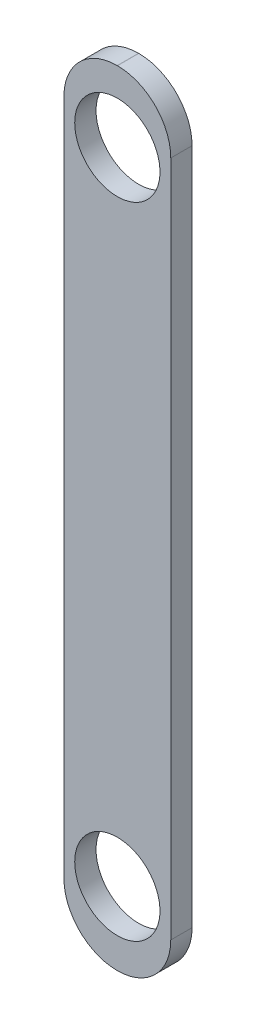
ISO-10303-21;
HEADER;
FILE_DESCRIPTION(('STEP AP214'),'2;1');
FILE_NAME('part.step','',(''),(''),'','','');
FILE_SCHEMA(('AUTOMOTIVE_DESIGN { 1 0 10303 214 1 1 1 1 }'));
ENDSEC;
DATA;
#1=APPLICATION_CONTEXT('core data for automotive mechanical design processes');
#2=APPLICATION_PROTOCOL_DEFINITION('international standard','automotive_design',2000,#1);
#3=PRODUCT_CONTEXT('',#1,'mechanical');
#4=PRODUCT('Part','Part','',(#3));
#5=PRODUCT_RELATED_PRODUCT_CATEGORY('part','',(#4));
#6=PRODUCT_DEFINITION_FORMATION('','',#4);
#7=PRODUCT_DEFINITION_CONTEXT('part definition',#1,'design');
#8=PRODUCT_DEFINITION('design','',#6,#7);
#9=PRODUCT_DEFINITION_SHAPE('','',#8);
#10=(LENGTH_UNIT() NAMED_UNIT(*) SI_UNIT(.MILLI.,.METRE.));
#11=(NAMED_UNIT(*) PLANE_ANGLE_UNIT() SI_UNIT($,.RADIAN.));
#12=(NAMED_UNIT(*) SI_UNIT($,.STERADIAN.) SOLID_ANGLE_UNIT());
#13=UNCERTAINTY_MEASURE_WITH_UNIT(LENGTH_MEASURE(1.E-05),#10,'distance_accuracy_value','');
#14=(GEOMETRIC_REPRESENTATION_CONTEXT(3) GLOBAL_UNCERTAINTY_ASSIGNED_CONTEXT((#13)) GLOBAL_UNIT_ASSIGNED_CONTEXT((#10,
#11,#12)) REPRESENTATION_CONTEXT('',''));
#15=CARTESIAN_POINT('',(0.,0.,0.));
#16=DIRECTION('',(0.,0.,1.));
#17=DIRECTION('',(1.,0.,0.));
#18=AXIS2_PLACEMENT_3D('',#15,#16,#17);
#19=CARTESIAN_POINT('',(-12.529775275469,-91.9210867781015,5.));
#20=DIRECTION('',(1.,0.,0.));
#21=DIRECTION('',(0.,0.,-1.));
#22=AXIS2_PLACEMENT_3D('',#19,#20,#21);
#23=PLANE('',#22);
#24=DIRECTION('',(0.,-1.,0.));
#25=VECTOR('',#24,1.);
#26=CARTESIAN_POINT('',(-12.529775275469,-91.9210867781015,0.));
#27=LINE('',#26,#25);
#28=CARTESIAN_POINT('',(-12.529775275469,79.4210867781014,0.));
#29=VERTEX_POINT('',#28);
#30=CARTESIAN_POINT('',(-12.529775275469,-79.4210867781015,0.));
#31=VERTEX_POINT('',#30);
#32=EDGE_CURVE('E132',#29,#31,#27,.T.);
#33=ORIENTED_EDGE('',*,*,#32,.T.);
#34=DIRECTION('',(0.,0.,-1.));
#35=VECTOR('',#34,1.);
#36=CARTESIAN_POINT('',(-12.529775275469,-79.4210867781015,5.));
#37=LINE('',#36,#35);
#38=CARTESIAN_POINT('',(-12.529775275469,-79.4210867781015,5.));
#39=VERTEX_POINT('',#38);
#40=EDGE_CURVE('E110',#31,#39,#37,.F.);
#41=ORIENTED_EDGE('',*,*,#40,.T.);
#42=DIRECTION('',(0.,-1.,0.));
#43=VECTOR('',#42,1.);
#44=CARTESIAN_POINT('',(-12.529775275469,-91.9210867781015,5.));
#45=LINE('',#44,#43);
#46=CARTESIAN_POINT('',(-12.529775275469,79.4210867781014,5.));
#47=VERTEX_POINT('',#46);
#48=EDGE_CURVE('E142',#47,#39,#45,.T.);
#49=ORIENTED_EDGE('',*,*,#48,.F.);
#50=DIRECTION('',(0.,0.,-1.));
#51=VECTOR('',#50,1.);
#52=CARTESIAN_POINT('',(-12.529775275469,79.4210867781015,5.));
#53=LINE('',#52,#51);
#54=EDGE_CURVE('E115',#47,#29,#53,.T.);
#55=ORIENTED_EDGE('',*,*,#54,.T.);
#56=EDGE_LOOP('',(#33,#41,#49,#55));
#57=FACE_BOUND('',#56,.T.);
#58=ADVANCED_FACE('F39',(#57),#23,.F.);
#59=CARTESIAN_POINT('',(12.529775275469,-91.9210867781015,5.));
#60=DIRECTION('',(0.,1.,0.));
#61=DIRECTION('',(0.,0.,1.));
#62=AXIS2_PLACEMENT_3D('',#59,#60,#61);
#63=PLANE('',#62);
#64=DIRECTION('',(1.,0.,0.));
#65=VECTOR('',#64,1.);
#66=CARTESIAN_POINT('',(12.529775275469,-91.9210867781015,5.));
#67=LINE('',#66,#65);
#68=CARTESIAN_POINT('',(-0.0297752754690392,-91.9210867781015,5.));
#69=VERTEX_POINT('',#68);
#70=CARTESIAN_POINT('',(0.029775275469034,-91.9210867781015,5.));
#71=VERTEX_POINT('',#70);
#72=EDGE_CURVE('E125',#69,#71,#67,.T.);
#73=ORIENTED_EDGE('',*,*,#72,.F.);
#74=DIRECTION('',(0.,0.,-1.));
#75=VECTOR('',#74,1.);
#76=CARTESIAN_POINT('',(-0.0297752754690392,-91.9210867781015,5.));
#77=LINE('',#76,#75);
#78=CARTESIAN_POINT('',(-0.0297752754690392,-91.9210867781015,0.));
#79=VERTEX_POINT('',#78);
#80=EDGE_CURVE('E109',#69,#79,#77,.T.);
#81=ORIENTED_EDGE('',*,*,#80,.T.);
#82=DIRECTION('',(1.,0.,0.));
#83=VECTOR('',#82,1.);
#84=CARTESIAN_POINT('',(12.529775275469,-91.9210867781015,0.));
#85=LINE('',#84,#83);
#86=CARTESIAN_POINT('',(0.029775275469034,-91.9210867781015,0.));
#87=VERTEX_POINT('',#86);
#88=EDGE_CURVE('E122',#79,#87,#85,.T.);
#89=ORIENTED_EDGE('',*,*,#88,.T.);
#90=DIRECTION('',(0.,0.,-1.));
#91=VECTOR('',#90,1.);
#92=CARTESIAN_POINT('',(0.029775275469034,-91.9210867781015,5.));
#93=LINE('',#92,#91);
#94=EDGE_CURVE('E127',#87,#71,#93,.F.);
#95=ORIENTED_EDGE('',*,*,#94,.T.);
#96=EDGE_LOOP('',(#73,#81,#89,#95));
#97=FACE_BOUND('',#96,.T.);
#98=ADVANCED_FACE('F121',(#97),#63,.F.);
#99=CARTESIAN_POINT('',(12.529775275469,-91.9210867781015,5.));
#100=DIRECTION('',(-1.,0.,0.));
#101=DIRECTION('',(0.,0.,1.));
#102=AXIS2_PLACEMENT_3D('',#99,#100,#101);
#103=PLANE('',#102);
#104=DIRECTION('',(0.,1.,0.));
#105=VECTOR('',#104,1.);
#106=CARTESIAN_POINT('',(12.529775275469,-91.9210867781015,5.));
#107=LINE('',#106,#105);
#108=CARTESIAN_POINT('',(12.529775275469,-79.4210867781015,5.));
#109=VERTEX_POINT('',#108);
#110=CARTESIAN_POINT('',(12.529775275469,79.4210867781014,5.));
#111=VERTEX_POINT('',#110);
#112=EDGE_CURVE('E168',#109,#111,#107,.T.);
#113=ORIENTED_EDGE('',*,*,#112,.F.);
#114=DIRECTION('',(0.,0.,-1.));
#115=VECTOR('',#114,1.);
#116=CARTESIAN_POINT('',(12.529775275469,-79.4210867781015,5.));
#117=LINE('',#116,#115);
#118=CARTESIAN_POINT('',(12.529775275469,-79.4210867781015,0.));
#119=VERTEX_POINT('',#118);
#120=EDGE_CURVE('E161',#109,#119,#117,.T.);
#121=ORIENTED_EDGE('',*,*,#120,.T.);
#122=DIRECTION('',(0.,1.,0.));
#123=VECTOR('',#122,1.);
#124=CARTESIAN_POINT('',(12.529775275469,-91.9210867781015,0.));
#125=LINE('',#124,#123);
#126=CARTESIAN_POINT('',(12.529775275469,79.4210867781014,0.));
#127=VERTEX_POINT('',#126);
#128=EDGE_CURVE('E131',#119,#127,#125,.T.);
#129=ORIENTED_EDGE('',*,*,#128,.T.);
#130=DIRECTION('',(0.,0.,-1.));
#131=VECTOR('',#130,1.);
#132=CARTESIAN_POINT('',(12.529775275469,79.4210867781015,5.));
#133=LINE('',#132,#131);
#134=EDGE_CURVE('E159',#127,#111,#133,.F.);
#135=ORIENTED_EDGE('',*,*,#134,.T.);
#136=EDGE_LOOP('',(#113,#121,#129,#135));
#137=FACE_BOUND('',#136,.T.);
#138=ADVANCED_FACE('F166',(#137),#103,.F.);
#139=CARTESIAN_POINT('',(12.529775275469,91.9210867781015,5.));
#140=DIRECTION('',(0.,-1.,0.));
#141=DIRECTION('',(1.,0.,0.));
#142=AXIS2_PLACEMENT_3D('',#139,#140,#141);
#143=PLANE('',#142);
#144=DIRECTION('',(-1.,0.,0.));
#145=VECTOR('',#144,1.);
#146=CARTESIAN_POINT('',(12.529775275469,91.9210867781015,5.));
#147=LINE('',#146,#145);
#148=CARTESIAN_POINT('',(0.029775275469027,91.9210867781015,5.));
#149=VERTEX_POINT('',#148);
#150=CARTESIAN_POINT('',(-0.0297752754690461,91.9210867781015,5.));
#151=VERTEX_POINT('',#150);
#152=EDGE_CURVE('E143',#149,#151,#147,.T.);
#153=ORIENTED_EDGE('',*,*,#152,.F.);
#154=DIRECTION('',(0.,0.,-1.));
#155=VECTOR('',#154,1.);
#156=CARTESIAN_POINT('',(0.029775275469027,91.9210867781015,5.));
#157=LINE('',#156,#155);
#158=CARTESIAN_POINT('',(0.029775275469027,91.9210867781015,0.));
#159=VERTEX_POINT('',#158);
#160=EDGE_CURVE('E11',#149,#159,#157,.T.);
#161=ORIENTED_EDGE('',*,*,#160,.T.);
#162=DIRECTION('',(-1.,0.,0.));
#163=VECTOR('',#162,1.);
#164=CARTESIAN_POINT('',(12.529775275469,91.9210867781015,0.));
#165=LINE('',#164,#163);
#166=CARTESIAN_POINT('',(-0.0297752754690461,91.9210867781015,0.));
#167=VERTEX_POINT('',#166);
#168=EDGE_CURVE('E135',#159,#167,#165,.T.);
#169=ORIENTED_EDGE('',*,*,#168,.T.);
#170=DIRECTION('',(0.,0.,-1.));
#171=VECTOR('',#170,1.);
#172=CARTESIAN_POINT('',(-0.0297752754690461,91.9210867781015,5.));
#173=LINE('',#172,#171);
#174=EDGE_CURVE('E47',#167,#151,#173,.F.);
#175=ORIENTED_EDGE('',*,*,#174,.T.);
#176=EDGE_LOOP('',(#153,#161,#169,#175));
#177=FACE_BOUND('',#176,.T.);
#178=ADVANCED_FACE('F175',(#177),#143,.F.);
#179=CARTESIAN_POINT('',(0.,0.,5.));
#180=DIRECTION('',(0.,0.,1.));
#181=DIRECTION('',(1.,0.,0.));
#182=AXIS2_PLACEMENT_3D('',#179,#180,#181);
#183=PLANE('',#182);
#184=CARTESIAN_POINT('',(0.,-74.8070163577958,5.));
#185=DIRECTION('',(0.,0.,-1.));
#186=DIRECTION('',(-1.,0.,0.));
#187=AXIS2_PLACEMENT_3D('',#184,#185,#186);
#188=CIRCLE('',#187,10.);
#189=CARTESIAN_POINT('',(-10.,-74.8070163577958,5.));
#190=VERTEX_POINT('',#189);
#191=EDGE_CURVE('E137',#190,#190,#188,.T.);
#192=ORIENTED_EDGE('',*,*,#191,.T.);
#193=EDGE_LOOP('',(#192));
#194=FACE_BOUND('',#193,.T.);
#195=CARTESIAN_POINT('',(0.,75.3124691710242,5.));
#196=DIRECTION('',(0.,0.,-1.));
#197=DIRECTION('',(-1.,0.,0.));
#198=AXIS2_PLACEMENT_3D('',#195,#196,#197);
#199=CIRCLE('',#198,10.);
#200=CARTESIAN_POINT('',(-10.,75.3124691710242,5.));
#201=VERTEX_POINT('',#200);
#202=EDGE_CURVE('E182',#201,#201,#199,.T.);
#203=ORIENTED_EDGE('',*,*,#202,.T.);
#204=EDGE_LOOP('',(#203));
#205=FACE_BOUND('',#204,.T.);
#206=ORIENTED_EDGE('',*,*,#48,.T.);
#207=CARTESIAN_POINT('',(-0.0297752754690392,-79.4210867781015,5.));
#208=DIRECTION('',(0.,0.,1.));
#209=DIRECTION('',(1.,0.,0.));
#210=AXIS2_PLACEMENT_3D('',#207,#208,#209);
#211=CIRCLE('',#210,12.5);
#212=EDGE_CURVE('E157',#39,#69,#211,.T.);
#213=ORIENTED_EDGE('',*,*,#212,.T.);
#214=ORIENTED_EDGE('',*,*,#72,.T.);
#215=CARTESIAN_POINT('',(0.029775275469034,-79.4210867781015,5.));
#216=DIRECTION('',(0.,0.,1.));
#217=DIRECTION('',(1.,0.,0.));
#218=AXIS2_PLACEMENT_3D('',#215,#216,#217);
#219=CIRCLE('',#218,12.5);
#220=EDGE_CURVE('E155',#71,#109,#219,.T.);
#221=ORIENTED_EDGE('',*,*,#220,.T.);
#222=ORIENTED_EDGE('',*,*,#112,.T.);
#223=CARTESIAN_POINT('',(0.029775275469034,79.4210867781015,5.));
#224=DIRECTION('',(0.,0.,1.));
#225=DIRECTION('',(1.,0.,0.));
#226=AXIS2_PLACEMENT_3D('',#223,#224,#225);
#227=CIRCLE('',#226,12.5);
#228=EDGE_CURVE('E60',#111,#149,#227,.T.);
#229=ORIENTED_EDGE('',*,*,#228,.T.);
#230=ORIENTED_EDGE('',*,*,#152,.T.);
#231=CARTESIAN_POINT('',(-0.0297752754690392,79.4210867781015,5.));
#232=DIRECTION('',(0.,0.,1.));
#233=DIRECTION('',(1.,0.,0.));
#234=AXIS2_PLACEMENT_3D('',#231,#232,#233);
#235=CIRCLE('',#234,12.5);
#236=EDGE_CURVE('E152',#151,#47,#235,.T.);
#237=ORIENTED_EDGE('',*,*,#236,.T.);
#238=EDGE_LOOP('',(#206,#213,#214,#221,#222,#229,#230,#237));
#239=FACE_BOUND('',#238,.T.);
#240=ADVANCED_FACE('F194',(#194,#205,#239),#183,.T.);
#241=CARTESIAN_POINT('',(0.,0.,0.));
#242=DIRECTION('',(0.,0.,1.));
#243=DIRECTION('',(1.,0.,0.));
#244=AXIS2_PLACEMENT_3D('',#241,#242,#243);
#245=PLANE('',#244);
#246=CARTESIAN_POINT('',(0.,-74.8070163577958,0.));
#247=DIRECTION('',(0.,0.,-1.));
#248=DIRECTION('',(-1.,0.,0.));
#249=AXIS2_PLACEMENT_3D('',#246,#247,#248);
#250=CIRCLE('',#249,10.);
#251=CARTESIAN_POINT('',(-10.,-74.8070163577958,0.));
#252=VERTEX_POINT('',#251);
#253=EDGE_CURVE('E188',#252,#252,#250,.T.);
#254=ORIENTED_EDGE('',*,*,#253,.F.);
#255=EDGE_LOOP('',(#254));
#256=FACE_BOUND('',#255,.T.);
#257=CARTESIAN_POINT('',(0.,75.3124691710242,0.));
#258=DIRECTION('',(0.,0.,-1.));
#259=DIRECTION('',(-1.,0.,0.));
#260=AXIS2_PLACEMENT_3D('',#257,#258,#259);
#261=CIRCLE('',#260,10.);
#262=CARTESIAN_POINT('',(-10.,75.3124691710242,0.));
#263=VERTEX_POINT('',#262);
#264=EDGE_CURVE('E185',#263,#263,#261,.T.);
#265=ORIENTED_EDGE('',*,*,#264,.F.);
#266=EDGE_LOOP('',(#265));
#267=FACE_BOUND('',#266,.T.);
#268=ORIENTED_EDGE('',*,*,#88,.F.);
#269=CARTESIAN_POINT('',(-0.0297752754690392,-79.4210867781015,0.));
#270=DIRECTION('',(0.,0.,1.));
#271=DIRECTION('',(1.,0.,0.));
#272=AXIS2_PLACEMENT_3D('',#269,#270,#271);
#273=CIRCLE('',#272,12.5);
#274=EDGE_CURVE('E105',#79,#31,#273,.F.);
#275=ORIENTED_EDGE('',*,*,#274,.T.);
#276=ORIENTED_EDGE('',*,*,#32,.F.);
#277=CARTESIAN_POINT('',(-0.0297752754690392,79.4210867781015,0.));
#278=DIRECTION('',(0.,0.,1.));
#279=DIRECTION('',(1.,0.,0.));
#280=AXIS2_PLACEMENT_3D('',#277,#278,#279);
#281=CIRCLE('',#280,12.5);
#282=EDGE_CURVE('E126',#29,#167,#281,.F.);
#283=ORIENTED_EDGE('',*,*,#282,.T.);
#284=ORIENTED_EDGE('',*,*,#168,.F.);
#285=CARTESIAN_POINT('',(0.029775275469034,79.4210867781015,0.));
#286=DIRECTION('',(0.,0.,1.));
#287=DIRECTION('',(1.,0.,0.));
#288=AXIS2_PLACEMENT_3D('',#285,#286,#287);
#289=CIRCLE('',#288,12.5);
#290=EDGE_CURVE('E146',#159,#127,#289,.F.);
#291=ORIENTED_EDGE('',*,*,#290,.T.);
#292=ORIENTED_EDGE('',*,*,#128,.F.);
#293=CARTESIAN_POINT('',(0.029775275469034,-79.4210867781015,0.));
#294=DIRECTION('',(0.,0.,1.));
#295=DIRECTION('',(1.,0.,0.));
#296=AXIS2_PLACEMENT_3D('',#293,#294,#295);
#297=CIRCLE('',#296,12.5);
#298=EDGE_CURVE('E116',#119,#87,#297,.F.);
#299=ORIENTED_EDGE('',*,*,#298,.T.);
#300=EDGE_LOOP('',(#268,#275,#276,#283,#284,#291,#292,#299));
#301=FACE_BOUND('',#300,.T.);
#302=ADVANCED_FACE('F129',(#256,#267,#301),#245,.F.);
#303=CARTESIAN_POINT('',(0.,75.3124691710242,5.));
#304=DIRECTION('',(0.,0.,-1.));
#305=DIRECTION('',(-1.,0.,0.));
#306=AXIS2_PLACEMENT_3D('',#303,#304,#305);
#307=CYLINDRICAL_SURFACE('',#306,10.);
#308=ORIENTED_EDGE('',*,*,#202,.F.);
#309=EDGE_LOOP('',(#308));
#310=FACE_BOUND('',#309,.T.);
#311=ORIENTED_EDGE('',*,*,#264,.T.);
#312=EDGE_LOOP('',(#311));
#313=FACE_BOUND('',#312,.T.);
#314=ADVANCED_FACE('F200',(#310,#313),#307,.F.);
#315=CARTESIAN_POINT('',(0.,-74.8070163577958,5.));
#316=DIRECTION('',(0.,0.,-1.));
#317=DIRECTION('',(-1.,0.,0.));
#318=AXIS2_PLACEMENT_3D('',#315,#316,#317);
#319=CYLINDRICAL_SURFACE('',#318,10.);
#320=ORIENTED_EDGE('',*,*,#191,.F.);
#321=EDGE_LOOP('',(#320));
#322=FACE_BOUND('',#321,.T.);
#323=ORIENTED_EDGE('',*,*,#253,.T.);
#324=EDGE_LOOP('',(#323));
#325=FACE_BOUND('',#324,.T.);
#326=ADVANCED_FACE('F197',(#322,#325),#319,.F.);
#327=CARTESIAN_POINT('',(-0.0297752754690392,-79.4210867781015,5.));
#328=DIRECTION('',(0.,0.,-1.));
#329=DIRECTION('',(-1.,0.,0.));
#330=AXIS2_PLACEMENT_3D('',#327,#328,#329);
#331=CYLINDRICAL_SURFACE('',#330,12.5);
#332=ORIENTED_EDGE('',*,*,#212,.F.);
#333=ORIENTED_EDGE('',*,*,#40,.F.);
#334=ORIENTED_EDGE('',*,*,#274,.F.);
#335=ORIENTED_EDGE('',*,*,#80,.F.);
#336=EDGE_LOOP('',(#332,#333,#334,#335));
#337=FACE_BOUND('',#336,.T.);
#338=ADVANCED_FACE('F108',(#337),#331,.T.);
#339=CARTESIAN_POINT('',(0.029775275469034,-79.4210867781015,5.));
#340=DIRECTION('',(0.,0.,-1.));
#341=DIRECTION('',(-1.,0.,0.));
#342=AXIS2_PLACEMENT_3D('',#339,#340,#341);
#343=CYLINDRICAL_SURFACE('',#342,12.5);
#344=ORIENTED_EDGE('',*,*,#220,.F.);
#345=ORIENTED_EDGE('',*,*,#94,.F.);
#346=ORIENTED_EDGE('',*,*,#298,.F.);
#347=ORIENTED_EDGE('',*,*,#120,.F.);
#348=EDGE_LOOP('',(#344,#345,#346,#347));
#349=FACE_BOUND('',#348,.T.);
#350=ADVANCED_FACE('F227',(#349),#343,.T.);
#351=CARTESIAN_POINT('',(0.029775275469034,79.4210867781015,5.));
#352=DIRECTION('',(0.,0.,-1.));
#353=DIRECTION('',(-1.,0.,0.));
#354=AXIS2_PLACEMENT_3D('',#351,#352,#353);
#355=CYLINDRICAL_SURFACE('',#354,12.5);
#356=ORIENTED_EDGE('',*,*,#228,.F.);
#357=ORIENTED_EDGE('',*,*,#134,.F.);
#358=ORIENTED_EDGE('',*,*,#290,.F.);
#359=ORIENTED_EDGE('',*,*,#160,.F.);
#360=EDGE_LOOP('',(#356,#357,#358,#359));
#361=FACE_BOUND('',#360,.T.);
#362=ADVANCED_FACE('F174',(#361),#355,.T.);
#363=CARTESIAN_POINT('',(-0.0297752754690392,79.4210867781015,5.));
#364=DIRECTION('',(0.,0.,-1.));
#365=DIRECTION('',(-1.,0.,0.));
#366=AXIS2_PLACEMENT_3D('',#363,#364,#365);
#367=CYLINDRICAL_SURFACE('',#366,12.5);
#368=ORIENTED_EDGE('',*,*,#236,.F.);
#369=ORIENTED_EDGE('',*,*,#174,.F.);
#370=ORIENTED_EDGE('',*,*,#282,.F.);
#371=ORIENTED_EDGE('',*,*,#54,.F.);
#372=EDGE_LOOP('',(#368,#369,#370,#371));
#373=FACE_BOUND('',#372,.T.);
#374=ADVANCED_FACE('F41',(#373),#367,.T.);
#375=CLOSED_SHELL('',(#58,#98,#138,#178,#240,#302,#314,#326,#338,#350,#362,#374));
#376=MANIFOLD_SOLID_BREP('B2',#375);
#377=ADVANCED_BREP_SHAPE_REPRESENTATION('',(#18,#376),#14);
#378=SHAPE_DEFINITION_REPRESENTATION(#9,#377);
ENDSEC;
END-ISO-10303-21;
